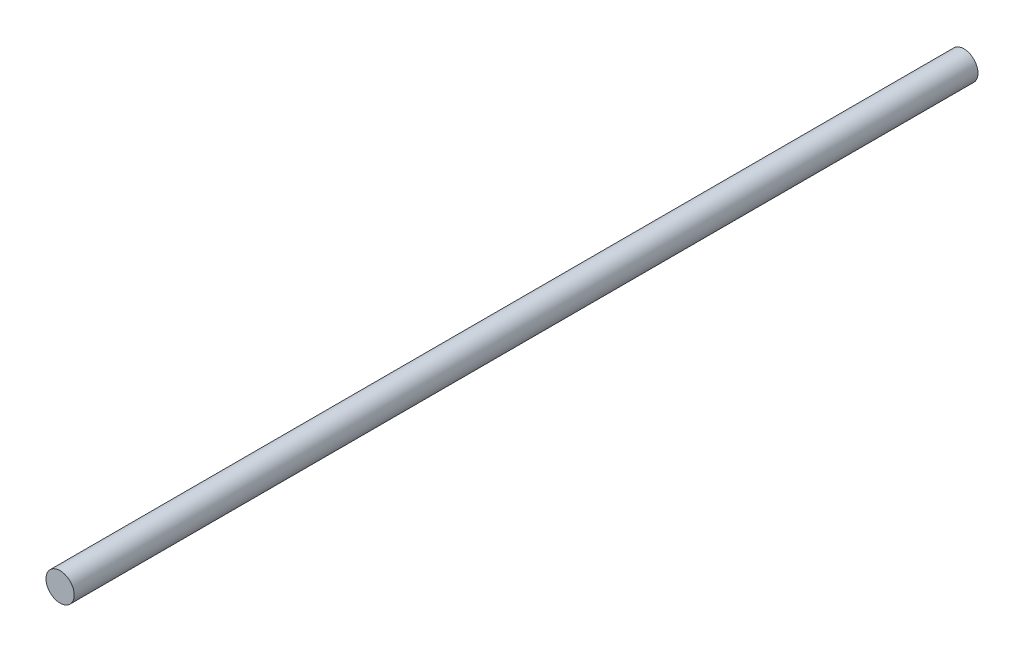
ISO-10303-21;
HEADER;
FILE_DESCRIPTION(('STEP AP214'),'2;1');
FILE_NAME('part.step','',(''),(''),'','','');
FILE_SCHEMA(('AUTOMOTIVE_DESIGN { 1 0 10303 214 1 1 1 1 }'));
ENDSEC;
DATA;
#1=APPLICATION_CONTEXT('core data for automotive mechanical design processes');
#2=APPLICATION_PROTOCOL_DEFINITION('international standard','automotive_design',2000,#1);
#3=PRODUCT_CONTEXT('',#1,'mechanical');
#4=PRODUCT('Part','Part','',(#3));
#5=PRODUCT_RELATED_PRODUCT_CATEGORY('part','',(#4));
#6=PRODUCT_DEFINITION_FORMATION('','',#4);
#7=PRODUCT_DEFINITION_CONTEXT('part definition',#1,'design');
#8=PRODUCT_DEFINITION('design','',#6,#7);
#9=PRODUCT_DEFINITION_SHAPE('','',#8);
#10=(LENGTH_UNIT() NAMED_UNIT(*) SI_UNIT(.MILLI.,.METRE.));
#11=(NAMED_UNIT(*) PLANE_ANGLE_UNIT() SI_UNIT($,.RADIAN.));
#12=(NAMED_UNIT(*) SI_UNIT($,.STERADIAN.) SOLID_ANGLE_UNIT());
#13=UNCERTAINTY_MEASURE_WITH_UNIT(LENGTH_MEASURE(1.E-05),#10,'distance_accuracy_value','');
#14=(GEOMETRIC_REPRESENTATION_CONTEXT(3) GLOBAL_UNCERTAINTY_ASSIGNED_CONTEXT((#13)) GLOBAL_UNIT_ASSIGNED_CONTEXT((#10,
#11,#12)) REPRESENTATION_CONTEXT('',''));
#15=CARTESIAN_POINT('',(0.,0.,0.));
#16=DIRECTION('',(0.,0.,1.));
#17=DIRECTION('',(1.,0.,0.));
#18=AXIS2_PLACEMENT_3D('',#15,#16,#17);
#19=CARTESIAN_POINT('',(0.,0.,0.));
#20=DIRECTION('',(0.,0.,1.));
#21=DIRECTION('',(1.,0.,0.));
#22=AXIS2_PLACEMENT_3D('',#19,#20,#21);
#23=PLANE('',#22);
#24=CARTESIAN_POINT('',(0.,0.,0.));
#25=DIRECTION('',(0.,0.,1.));
#26=DIRECTION('',(1.,0.,0.));
#27=AXIS2_PLACEMENT_3D('',#24,#25,#26);
#28=CIRCLE('',#27,2.54);
#29=CARTESIAN_POINT('',(2.54,0.,0.));
#30=VERTEX_POINT('',#29);
#31=EDGE_CURVE('E44',#30,#30,#28,.T.);
#32=ORIENTED_EDGE('',*,*,#31,.T.);
#33=EDGE_LOOP('',(#32));
#34=FACE_BOUND('',#33,.T.);
#35=ADVANCED_FACE('F37',(#34),#23,.T.);
#36=CARTESIAN_POINT('',(0.,0.,-162.814));
#37=DIRECTION('',(0.,0.,1.));
#38=DIRECTION('',(1.,0.,0.));
#39=AXIS2_PLACEMENT_3D('',#36,#37,#38);
#40=PLANE('',#39);
#41=CARTESIAN_POINT('',(0.,0.,-162.814));
#42=DIRECTION('',(0.,0.,1.));
#43=DIRECTION('',(1.,0.,0.));
#44=AXIS2_PLACEMENT_3D('',#41,#42,#43);
#45=CIRCLE('',#44,2.54);
#46=CARTESIAN_POINT('',(2.54,0.,-162.814));
#47=VERTEX_POINT('',#46);
#48=EDGE_CURVE('E10',#47,#47,#45,.T.);
#49=ORIENTED_EDGE('',*,*,#48,.F.);
#50=EDGE_LOOP('',(#49));
#51=FACE_BOUND('',#50,.T.);
#52=ADVANCED_FACE('F54',(#51),#40,.F.);
#53=CARTESIAN_POINT('',(0.,0.,0.));
#54=DIRECTION('',(0.,0.,-1.));
#55=DIRECTION('',(-1.,0.,0.));
#56=AXIS2_PLACEMENT_3D('',#53,#54,#55);
#57=CYLINDRICAL_SURFACE('',#56,2.54);
#58=ORIENTED_EDGE('',*,*,#48,.T.);
#59=EDGE_LOOP('',(#58));
#60=FACE_BOUND('',#59,.T.);
#61=ORIENTED_EDGE('',*,*,#31,.F.);
#62=EDGE_LOOP('',(#61));
#63=FACE_BOUND('',#62,.T.);
#64=ADVANCED_FACE('F52',(#60,#63),#57,.T.);
#65=CLOSED_SHELL('',(#35,#52,#64));
#66=MANIFOLD_SOLID_BREP('B2',#65);
#67=ADVANCED_BREP_SHAPE_REPRESENTATION('',(#18,#66),#14);
#68=SHAPE_DEFINITION_REPRESENTATION(#9,#67);
ENDSEC;
END-ISO-10303-21;
